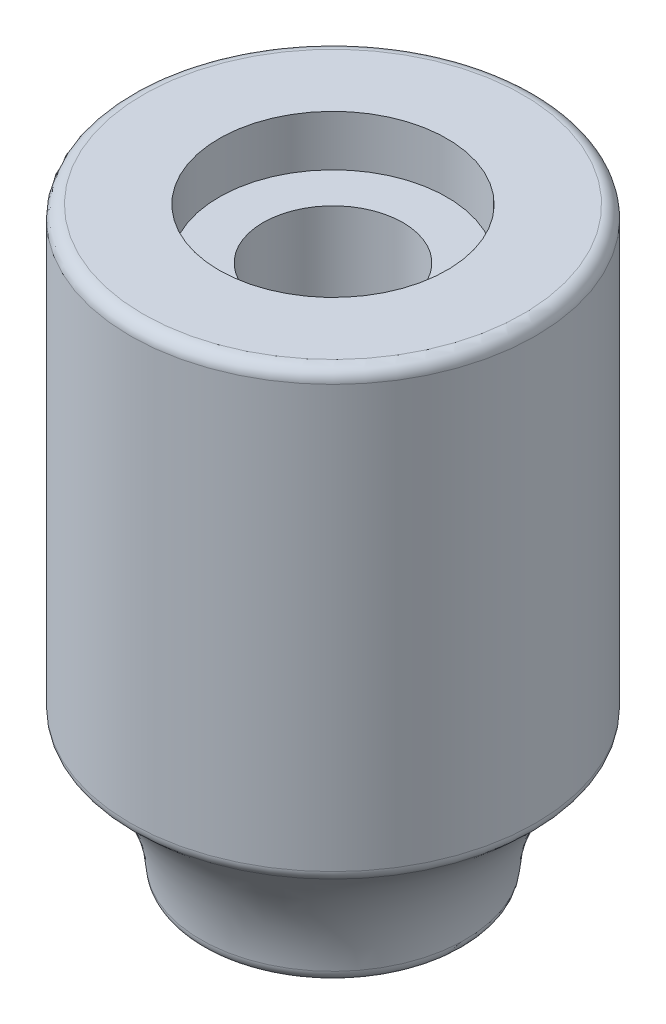
ISO-10303-21;
HEADER;
FILE_DESCRIPTION(('STEP AP214'),'2;1');
FILE_NAME('part.step','',(''),(''),'','','');
FILE_SCHEMA(('AUTOMOTIVE_DESIGN { 1 0 10303 214 1 1 1 1 }'));
ENDSEC;
DATA;
#1=APPLICATION_CONTEXT('core data for automotive mechanical design processes');
#2=APPLICATION_PROTOCOL_DEFINITION('international standard','automotive_design',2000,#1);
#3=PRODUCT_CONTEXT('',#1,'mechanical');
#4=PRODUCT('Part','Part','',(#3));
#5=PRODUCT_RELATED_PRODUCT_CATEGORY('part','',(#4));
#6=PRODUCT_DEFINITION_FORMATION('','',#4);
#7=PRODUCT_DEFINITION_CONTEXT('part definition',#1,'design');
#8=PRODUCT_DEFINITION('design','',#6,#7);
#9=PRODUCT_DEFINITION_SHAPE('','',#8);
#10=(LENGTH_UNIT() NAMED_UNIT(*) SI_UNIT(.MILLI.,.METRE.));
#11=(NAMED_UNIT(*) PLANE_ANGLE_UNIT() SI_UNIT($,.RADIAN.));
#12=(NAMED_UNIT(*) SI_UNIT($,.STERADIAN.) SOLID_ANGLE_UNIT());
#13=UNCERTAINTY_MEASURE_WITH_UNIT(LENGTH_MEASURE(1.E-05),#10,'distance_accuracy_value','');
#14=(GEOMETRIC_REPRESENTATION_CONTEXT(3) GLOBAL_UNCERTAINTY_ASSIGNED_CONTEXT((#13)) GLOBAL_UNIT_ASSIGNED_CONTEXT((#10,
#11,#12)) REPRESENTATION_CONTEXT('',''));
#15=CARTESIAN_POINT('',(0.,0.,0.));
#16=DIRECTION('',(0.,0.,1.));
#17=DIRECTION('',(1.,0.,0.));
#18=AXIS2_PLACEMENT_3D('',#15,#16,#17);
#19=CARTESIAN_POINT('',(0.,73.025,0.));
#20=DIRECTION('',(0.,-1.,0.));
#21=DIRECTION('',(0.,0.,-1.));
#22=AXIS2_PLACEMENT_3D('',#19,#20,#21);
#23=CYLINDRICAL_SURFACE('',#22,25.4);
#24=CARTESIAN_POINT('',(0.,71.4375,0.));
#25=DIRECTION('',(0.,1.,0.));
#26=DIRECTION('',(0.,0.,1.));
#27=AXIS2_PLACEMENT_3D('',#24,#25,#26);
#28=CIRCLE('',#27,25.4);
#29=CARTESIAN_POINT('',(0.,71.4375,25.4));
#30=VERTEX_POINT('',#29);
#31=EDGE_CURVE('E61',#30,#30,#28,.F.);
#32=ORIENTED_EDGE('',*,*,#31,.T.);
#33=EDGE_LOOP('',(#32));
#34=FACE_BOUND('',#33,.T.);
#35=CARTESIAN_POINT('',(0.,18.5567817791771,0.));
#36=DIRECTION('',(0.,1.,0.));
#37=DIRECTION('',(0.,0.,1.));
#38=AXIS2_PLACEMENT_3D('',#35,#36,#37);
#39=CIRCLE('',#38,25.4);
#40=CARTESIAN_POINT('',(0.,18.5567817791771,25.4));
#41=VERTEX_POINT('',#40);
#42=EDGE_CURVE('E67',#41,#41,#39,.T.);
#43=ORIENTED_EDGE('',*,*,#42,.T.);
#44=EDGE_LOOP('',(#43));
#45=FACE_BOUND('',#44,.T.);
#46=ADVANCED_FACE('F43',(#34,#45),#23,.T.);
#47=CARTESIAN_POINT('',(0.,0.,0.));
#48=DIRECTION('',(0.,1.,0.));
#49=DIRECTION('',(0.,0.,1.));
#50=AXIS2_PLACEMENT_3D('',#47,#48,#49);
#51=PLANE('',#50);
#52=CARTESIAN_POINT('',(0.,0.,0.));
#53=DIRECTION('',(0.,1.,0.));
#54=DIRECTION('',(0.,0.,1.));
#55=AXIS2_PLACEMENT_3D('',#52,#53,#54);
#56=CIRCLE('',#55,14.9754755939855);
#57=CARTESIAN_POINT('',(0.,0.,14.9754755939855));
#58=VERTEX_POINT('',#57);
#59=EDGE_CURVE('E10',#58,#58,#56,.F.);
#60=ORIENTED_EDGE('',*,*,#59,.T.);
#61=EDGE_LOOP('',(#60));
#62=FACE_BOUND('',#61,.T.);
#63=CARTESIAN_POINT('',(0.,0.,0.));
#64=DIRECTION('',(0.,-1.,0.));
#65=DIRECTION('',(0.,0.,-1.));
#66=AXIS2_PLACEMENT_3D('',#63,#64,#65);
#67=CIRCLE('',#66,14.2875);
#68=CARTESIAN_POINT('',(0.,0.,-14.2875));
#69=VERTEX_POINT('',#68);
#70=EDGE_CURVE('E89',#69,#69,#67,.T.);
#71=ORIENTED_EDGE('',*,*,#70,.F.);
#72=EDGE_LOOP('',(#71));
#73=FACE_BOUND('',#72,.T.);
#74=ADVANCED_FACE('F118',(#62,#73),#51,.F.);
#75=CARTESIAN_POINT('',(0.,73.025,0.));
#76=DIRECTION('',(0.,1.,0.));
#77=DIRECTION('',(0.,0.,1.));
#78=AXIS2_PLACEMENT_3D('',#75,#76,#77);
#79=PLANE('',#78);
#80=CARTESIAN_POINT('',(0.,73.025,0.));
#81=DIRECTION('',(0.,1.,0.));
#82=DIRECTION('',(0.,0.,1.));
#83=AXIS2_PLACEMENT_3D('',#80,#81,#82);
#84=CIRCLE('',#83,23.8125);
#85=CARTESIAN_POINT('',(0.,73.025,23.8125));
#86=VERTEX_POINT('',#85);
#87=EDGE_CURVE('E71',#86,#86,#84,.T.);
#88=ORIENTED_EDGE('',*,*,#87,.T.);
#89=EDGE_LOOP('',(#88));
#90=FACE_BOUND('',#89,.T.);
#91=CARTESIAN_POINT('',(0.,73.025,0.));
#92=DIRECTION('',(0.,1.,0.));
#93=DIRECTION('',(0.,0.,1.));
#94=AXIS2_PLACEMENT_3D('',#91,#92,#93);
#95=CIRCLE('',#94,14.2875);
#96=CARTESIAN_POINT('',(0.,73.025,14.2875));
#97=VERTEX_POINT('',#96);
#98=EDGE_CURVE('E81',#97,#97,#95,.T.);
#99=ORIENTED_EDGE('',*,*,#98,.F.);
#100=EDGE_LOOP('',(#99));
#101=FACE_BOUND('',#100,.T.);
#102=ADVANCED_FACE('F113',(#90,#101),#79,.T.);
#103=CARTESIAN_POINT('',(0.,66.675,0.));
#104=DIRECTION('',(0.,1.,0.));
#105=DIRECTION('',(0.,0.,1.));
#106=AXIS2_PLACEMENT_3D('',#103,#104,#105);
#107=CYLINDRICAL_SURFACE('',#106,14.2875);
#108=CARTESIAN_POINT('',(0.,66.675,0.));
#109=DIRECTION('',(0.,1.,0.));
#110=DIRECTION('',(0.,0.,1.));
#111=AXIS2_PLACEMENT_3D('',#108,#109,#110);
#112=CIRCLE('',#111,14.2875);
#113=CARTESIAN_POINT('',(0.,66.675,14.2875));
#114=VERTEX_POINT('',#113);
#115=EDGE_CURVE('E75',#114,#114,#112,.T.);
#116=ORIENTED_EDGE('',*,*,#115,.F.);
#117=EDGE_LOOP('',(#116));
#118=FACE_BOUND('',#117,.T.);
#119=ORIENTED_EDGE('',*,*,#98,.T.);
#120=EDGE_LOOP('',(#119));
#121=FACE_BOUND('',#120,.T.);
#122=ADVANCED_FACE('F107',(#118,#121),#107,.F.);
#123=CARTESIAN_POINT('',(0.,66.675,0.));
#124=DIRECTION('',(0.,1.,0.));
#125=DIRECTION('',(0.,0.,1.));
#126=AXIS2_PLACEMENT_3D('',#123,#124,#125);
#127=PLANE('',#126);
#128=CARTESIAN_POINT('',(0.,66.675,0.));
#129=DIRECTION('',(0.,1.,0.));
#130=DIRECTION('',(0.,0.,1.));
#131=AXIS2_PLACEMENT_3D('',#128,#129,#130);
#132=CIRCLE('',#131,8.763);
#133=CARTESIAN_POINT('',(0.,66.675,8.763));
#134=VERTEX_POINT('',#133);
#135=EDGE_CURVE('E80',#134,#134,#132,.T.);
#136=ORIENTED_EDGE('',*,*,#135,.F.);
#137=EDGE_LOOP('',(#136));
#138=FACE_BOUND('',#137,.T.);
#139=ORIENTED_EDGE('',*,*,#115,.T.);
#140=EDGE_LOOP('',(#139));
#141=FACE_BOUND('',#140,.T.);
#142=ADVANCED_FACE('F103',(#138,#141),#127,.T.);
#143=CARTESIAN_POINT('',(0.,6.35,0.));
#144=DIRECTION('',(0.,-1.,0.));
#145=DIRECTION('',(0.,0.,-1.));
#146=AXIS2_PLACEMENT_3D('',#143,#144,#145);
#147=CYLINDRICAL_SURFACE('',#146,14.2875);
#148=CARTESIAN_POINT('',(0.,6.35,0.));
#149=DIRECTION('',(0.,-1.,0.));
#150=DIRECTION('',(0.,0.,-1.));
#151=AXIS2_PLACEMENT_3D('',#148,#149,#150);
#152=CIRCLE('',#151,14.2875);
#153=CARTESIAN_POINT('',(0.,6.35,-14.2875));
#154=VERTEX_POINT('',#153);
#155=EDGE_CURVE('E85',#154,#154,#152,.T.);
#156=ORIENTED_EDGE('',*,*,#155,.F.);
#157=EDGE_LOOP('',(#156));
#158=FACE_BOUND('',#157,.T.);
#159=ORIENTED_EDGE('',*,*,#70,.T.);
#160=EDGE_LOOP('',(#159));
#161=FACE_BOUND('',#160,.T.);
#162=ADVANCED_FACE('F106',(#158,#161),#147,.F.);
#163=CARTESIAN_POINT('',(0.,6.35,0.));
#164=DIRECTION('',(0.,-1.,0.));
#165=DIRECTION('',(0.,0.,-1.));
#166=AXIS2_PLACEMENT_3D('',#163,#164,#165);
#167=PLANE('',#166);
#168=CARTESIAN_POINT('',(0.,6.34999999999999,0.));
#169=DIRECTION('',(0.,-1.,0.));
#170=DIRECTION('',(0.,0.,-1.));
#171=AXIS2_PLACEMENT_3D('',#168,#169,#170);
#172=CIRCLE('',#171,8.763);
#173=CARTESIAN_POINT('',(0.,6.34999999999999,-8.763));
#174=VERTEX_POINT('',#173);
#175=EDGE_CURVE('E76',#174,#174,#172,.T.);
#176=ORIENTED_EDGE('',*,*,#175,.F.);
#177=EDGE_LOOP('',(#176));
#178=FACE_BOUND('',#177,.T.);
#179=ORIENTED_EDGE('',*,*,#155,.T.);
#180=EDGE_LOOP('',(#179));
#181=FACE_BOUND('',#180,.T.);
#182=ADVANCED_FACE('F155',(#178,#181),#167,.T.);
#183=CARTESIAN_POINT('',(0.,73.025,0.));
#184=DIRECTION('',(0.,-1.,0.));
#185=DIRECTION('',(0.,0.,-1.));
#186=AXIS2_PLACEMENT_3D('',#183,#184,#185);
#187=CYLINDRICAL_SURFACE('',#186,8.763);
#188=ORIENTED_EDGE('',*,*,#135,.T.);
#189=EDGE_LOOP('',(#188));
#190=FACE_BOUND('',#189,.T.);
#191=ORIENTED_EDGE('',*,*,#175,.T.);
#192=EDGE_LOOP('',(#191));
#193=FACE_BOUND('',#192,.T.);
#194=ADVANCED_FACE('F100',(#190,#193),#187,.F.);
#195=CARTESIAN_POINT('',(0.,0.,0.));
#196=DIRECTION('',(0.,1.,0.));
#197=DIRECTION('',(0.,0.,1.));
#198=AXIS2_PLACEMENT_3D('',#195,#196,#197);
#199=TOROIDAL_SURFACE('',#198,38.735,22.225);
#200=CARTESIAN_POINT('',(0.,17.3196629938986,0.));
#201=DIRECTION('',(0.,-1.,0.));
#202=DIRECTION('',(0.,0.,-1.));
#203=AXIS2_PLACEMENT_3D('',#200,#201,#202);
#204=CIRCLE('',#203,24.8073333333334);
#205=CARTESIAN_POINT('',(0.,17.3196629938986,-24.8073333333334));
#206=VERTEX_POINT('',#205);
#207=EDGE_CURVE('E51',#206,#206,#204,.T.);
#208=ORIENTED_EDGE('',*,*,#207,.T.);
#209=EDGE_LOOP('',(#208));
#210=FACE_BOUND('',#209,.T.);
#211=CARTESIAN_POINT('',(0.,1.48166666666667,0.));
#212=DIRECTION('',(0.,-1.,0.));
#213=DIRECTION('',(0.,0.,-1.));
#214=AXIS2_PLACEMENT_3D('',#211,#212,#213);
#215=CIRCLE('',#214,16.5594438877198);
#216=CARTESIAN_POINT('',(0.,1.48166666666667,-16.5594438877198));
#217=VERTEX_POINT('',#216);
#218=EDGE_CURVE('E56',#217,#217,#215,.F.);
#219=ORIENTED_EDGE('',*,*,#218,.T.);
#220=EDGE_LOOP('',(#219));
#221=FACE_BOUND('',#220,.T.);
#222=ADVANCED_FACE('F137',(#210,#221),#199,.F.);
#223=CARTESIAN_POINT('',(0.,71.4375,0.));
#224=DIRECTION('',(0.,1.,0.));
#225=DIRECTION('',(0.,0.,1.));
#226=AXIS2_PLACEMENT_3D('',#223,#224,#225);
#227=TOROIDAL_SURFACE('',#226,23.8125,1.5875);
#228=ORIENTED_EDGE('',*,*,#31,.F.);
#229=EDGE_LOOP('',(#228));
#230=FACE_BOUND('',#229,.T.);
#231=ORIENTED_EDGE('',*,*,#87,.F.);
#232=EDGE_LOOP('',(#231));
#233=FACE_BOUND('',#232,.T.);
#234=ADVANCED_FACE('F134',(#230,#233),#227,.T.);
#235=CARTESIAN_POINT('',(0.,18.5567817791771,0.));
#236=DIRECTION('',(0.,1.,0.));
#237=DIRECTION('',(0.,0.,1.));
#238=AXIS2_PLACEMENT_3D('',#235,#236,#237);
#239=TOROIDAL_SURFACE('',#238,23.8125,1.5875);
#240=ORIENTED_EDGE('',*,*,#42,.F.);
#241=EDGE_LOOP('',(#240));
#242=FACE_BOUND('',#241,.T.);
#243=ORIENTED_EDGE('',*,*,#207,.F.);
#244=EDGE_LOOP('',(#243));
#245=FACE_BOUND('',#244,.T.);
#246=ADVANCED_FACE('F136',(#242,#245),#239,.T.);
#247=CARTESIAN_POINT('',(0.,1.5875,0.));
#248=DIRECTION('',(0.,-1.,0.));
#249=DIRECTION('',(0.,0.,-1.));
#250=AXIS2_PLACEMENT_3D('',#247,#248,#249);
#251=TOROIDAL_SURFACE('',#250,14.9754755939855,1.5875);
#252=ORIENTED_EDGE('',*,*,#59,.F.);
#253=EDGE_LOOP('',(#252));
#254=FACE_BOUND('',#253,.T.);
#255=ORIENTED_EDGE('',*,*,#218,.F.);
#256=EDGE_LOOP('',(#255));
#257=FACE_BOUND('',#256,.T.);
#258=ADVANCED_FACE('F45',(#254,#257),#251,.T.);
#259=CLOSED_SHELL('',(#46,#74,#102,#122,#142,#162,#182,#194,#222,#234,#246,#258));
#260=MANIFOLD_SOLID_BREP('B2',#259);
#261=ADVANCED_BREP_SHAPE_REPRESENTATION('',(#18,#260),#14);
#262=SHAPE_DEFINITION_REPRESENTATION(#9,#261);
ENDSEC;
END-ISO-10303-21;
